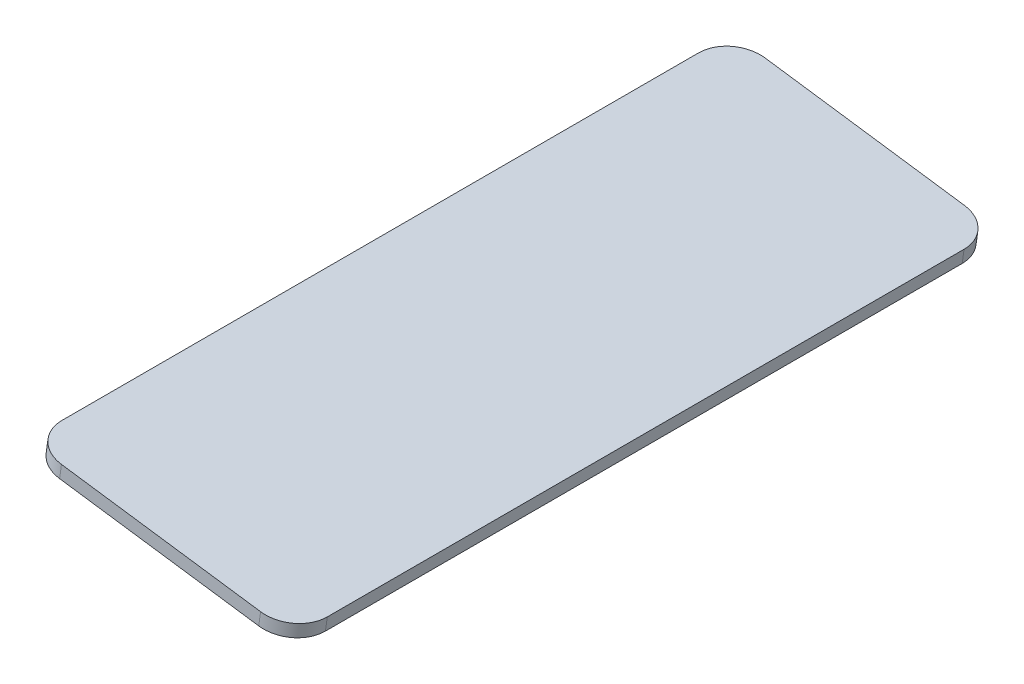
ISO-10303-21;
HEADER;
FILE_DESCRIPTION(('STEP AP214'),'2;1');
FILE_NAME('part.step','',(''),(''),'','','');
FILE_SCHEMA(('AUTOMOTIVE_DESIGN { 1 0 10303 214 1 1 1 1 }'));
ENDSEC;
DATA;
#1=APPLICATION_CONTEXT('core data for automotive mechanical design processes');
#2=APPLICATION_PROTOCOL_DEFINITION('international standard','automotive_design',2000,#1);
#3=PRODUCT_CONTEXT('',#1,'mechanical');
#4=PRODUCT('Part','Part','',(#3));
#5=PRODUCT_RELATED_PRODUCT_CATEGORY('part','',(#4));
#6=PRODUCT_DEFINITION_FORMATION('','',#4);
#7=PRODUCT_DEFINITION_CONTEXT('part definition',#1,'design');
#8=PRODUCT_DEFINITION('design','',#6,#7);
#9=PRODUCT_DEFINITION_SHAPE('','',#8);
#10=(LENGTH_UNIT() NAMED_UNIT(*) SI_UNIT(.MILLI.,.METRE.));
#11=(NAMED_UNIT(*) PLANE_ANGLE_UNIT() SI_UNIT($,.RADIAN.));
#12=(NAMED_UNIT(*) SI_UNIT($,.STERADIAN.) SOLID_ANGLE_UNIT());
#13=UNCERTAINTY_MEASURE_WITH_UNIT(LENGTH_MEASURE(1.E-05),#10,'distance_accuracy_value','');
#14=(GEOMETRIC_REPRESENTATION_CONTEXT(3) GLOBAL_UNCERTAINTY_ASSIGNED_CONTEXT((#13)) GLOBAL_UNIT_ASSIGNED_CONTEXT((#10,
#11,#12)) REPRESENTATION_CONTEXT('',''));
#15=CARTESIAN_POINT('',(0.,0.,0.));
#16=DIRECTION('',(0.,0.,1.));
#17=DIRECTION('',(1.,0.,0.));
#18=AXIS2_PLACEMENT_3D('',#15,#16,#17);
#19=CARTESIAN_POINT('',(241.030415462695,743.692615061552,-1647.));
#20=CARTESIAN_POINT('',(241.493364411612,743.627551829847,-1646.99621379538));
#21=CARTESIAN_POINT('',(242.419262309444,743.497425366437,-1646.98864138611));
#22=CARTESIAN_POINT('',(243.807021687024,743.302388505145,-1646.92742237047));
#23=CARTESIAN_POINT('',(245.423473379441,743.075211035037,-1646.81343082794));
#24=CARTESIAN_POINT('',(247.26549465002,742.81633182813,-1646.61677087434));
#25=CARTESIAN_POINT('',(249.32665900537,742.52665406917,-1646.30811990588));
#26=CARTESIAN_POINT('',(251.373183667329,742.239033784939,-1645.91205464819));
#27=CARTESIAN_POINT('',(254.076992559647,741.859038226337,-1645.2687127721));
#28=CARTESIAN_POINT('',(257.403060557336,741.391589853664,-1644.24987739416));
#29=CARTESIAN_POINT('',(261.277737551625,740.847039514685,-1642.69306378961));
#30=CARTESIAN_POINT('',(265.009273663722,740.322606314769,-1640.81284696584));
#31=CARTESIAN_POINT('',(268.571071013926,739.82202834213,-1638.62257491967));
#32=CARTESIAN_POINT('',(271.937973567542,739.348841046883,-1636.13773704623));
#33=CARTESIAN_POINT('',(275.086140082098,738.906395097145,-1633.37592163584));
#34=CARTESIAN_POINT('',(277.993294633038,738.497821169947,-1630.35667302064));
#35=CARTESIAN_POINT('',(280.638862139272,738.126010904359,-1627.10135966722));
#36=CARTESIAN_POINT('',(283.004120658046,737.793595497844,-1623.63301570002));
#37=CARTESIAN_POINT('',(285.072329262688,737.502927734209,-1619.97620048731));
#38=CARTESIAN_POINT('',(286.828858304187,737.256063676537,-1616.15674169103));
#39=CARTESIAN_POINT('',(288.261250419693,737.054754093003,-1612.20186245812));
#40=CARTESIAN_POINT('',(289.176471411075,736.926128170937,-1608.81585391766));
#41=CARTESIAN_POINT('',(289.737507729592,736.847279658434,-1606.06850419926));
#42=CARTESIAN_POINT('',(290.07204710889,736.800263214827,-1603.99156823446));
#43=CARTESIAN_POINT('',(290.320222860817,736.765384387498,-1601.90231762147));
#44=CARTESIAN_POINT('',(290.461942118239,736.745467044767,-1600.03740891089));
#45=CARTESIAN_POINT('',(290.532550732985,736.735543651113,-1598.40250024472));
#46=CARTESIAN_POINT('',(290.540062844178,736.734487892736,-1597.46750008159));
#47=CARTESIAN_POINT('',(290.543818899775,736.733960013547,-1597.));
#48=B_SPLINE_CURVE_WITH_KNOTS('',3,(#19,#20,#21,#22,#23,#24,#25,#26,#27,#28,#29,#30,#31,#32,#33,
#34,#35,#36,#37,#38,#39,#40,#41,#42,#43,#44,#45,#46,#47),.UNSPECIFIED.,.F.,.F.,(4,1,1,1,1,1,1,1,
1,1,1,1,1,1,1,1,1,1,1,1,1,1,1,1,1,1,4),(0.,0.0178605614737639,0.0357211229475166,
0.0535816844212812,0.0803714411518224,0.107161168136601,0.13395091203215,0.160740656876938,
0.21430828955088,0.267875922224825,0.321443554898773,0.375011187572713,0.428578820246657,
0.482146452920603,0.535714085594545,0.589281718268495,0.642849350942433,0.696416983616375,
0.74998461629032,0.803552248964268,0.857119881638214,0.883909624248138,0.910699369933994,
0.937489166710273,0.964278877052679,0.982139438526334,1.),.UNSPECIFIED.);
#49=DIRECTION('',(0.139173100960106,0.990268068741565,0.));
#50=VECTOR('',#49,1.);
#51=SURFACE_OF_LINEAR_EXTRUSION('',#48,#50);
#52=CARTESIAN_POINT('',(243.813877481897,763.497976436383,-1647.));
#53=CARTESIAN_POINT('',(244.276826430814,763.432913204678,-1646.99621379538));
#54=CARTESIAN_POINT('',(245.202724328646,763.302786741268,-1646.98864138611));
#55=CARTESIAN_POINT('',(246.590483706225,763.107749879976,-1646.92742237047));
#56=CARTESIAN_POINT('',(248.206935398643,762.880572409868,-1646.81343082794));
#57=CARTESIAN_POINT('',(250.048956669222,762.621693202961,-1646.61677087434));
#58=CARTESIAN_POINT('',(252.110121024572,762.332015444001,-1646.30811990588));
#59=CARTESIAN_POINT('',(254.156645686531,762.044395159771,-1645.91205464819));
#60=CARTESIAN_POINT('',(256.86045457885,761.664399601168,-1645.2687127721));
#61=CARTESIAN_POINT('',(260.186522576538,761.196951228496,-1644.24987739416));
#62=CARTESIAN_POINT('',(264.061199570827,760.652400889516,-1642.69306378961));
#63=CARTESIAN_POINT('',(267.792735682923,760.1279676896,-1640.81284696584));
#64=CARTESIAN_POINT('',(271.354533033128,759.627389716961,-1638.62257491967));
#65=CARTESIAN_POINT('',(274.721435586745,759.154202421714,-1636.13773704623));
#66=CARTESIAN_POINT('',(277.869602101301,758.711756471976,-1633.37592163584));
#67=CARTESIAN_POINT('',(280.77675665224,758.303182544778,-1630.35667302064));
#68=CARTESIAN_POINT('',(283.422324158475,757.93137227919,-1627.10135966722));
#69=CARTESIAN_POINT('',(285.787582677248,757.598956872675,-1623.63301570002));
#70=CARTESIAN_POINT('',(287.855791281891,757.30828910904,-1619.97620048731));
#71=CARTESIAN_POINT('',(289.612320323389,757.061425051368,-1616.15674169103));
#72=CARTESIAN_POINT('',(291.044712438895,756.860115467834,-1612.20186245812));
#73=CARTESIAN_POINT('',(291.959933430277,756.731489545768,-1608.81585391766));
#74=CARTESIAN_POINT('',(292.520969748795,756.652641033265,-1606.06850419926));
#75=CARTESIAN_POINT('',(292.855509128092,756.605624589658,-1603.99156823446));
#76=CARTESIAN_POINT('',(293.103684880019,756.570745762329,-1601.90231762147));
#77=CARTESIAN_POINT('',(293.245404137441,756.550828419598,-1600.03740891089));
#78=CARTESIAN_POINT('',(293.316012752187,756.540905025944,-1598.40250024472));
#79=CARTESIAN_POINT('',(293.323524863381,756.539849267567,-1597.46750008159));
#80=CARTESIAN_POINT('',(293.327280918978,756.539321388378,-1597.));
#81=B_SPLINE_CURVE_WITH_KNOTS('',3,(#52,#53,#54,#55,#56,#57,#58,#59,#60,#61,#62,#63,#64,#65,#66,
#67,#68,#69,#70,#71,#72,#73,#74,#75,#76,#77,#78,#79,#80),.UNSPECIFIED.,.F.,.F.,(4,1,1,1,1,1,1,1,
1,1,1,1,1,1,1,1,1,1,1,1,1,1,1,1,1,1,4),(0.,0.0178605614737639,0.0357211229475166,
0.0535816844212812,0.0803714411518224,0.107161168136601,0.13395091203215,0.160740656876938,
0.21430828955088,0.267875922224825,0.321443554898773,0.375011187572713,0.428578820246657,
0.482146452920603,0.535714085594545,0.589281718268495,0.642849350942433,0.696416983616375,
0.74998461629032,0.803552248964268,0.857119881638214,0.883909624248138,0.910699369933994,
0.937489166710273,0.964278877052679,0.982139438526334,1.),.UNSPECIFIED.);
#82=CARTESIAN_POINT('',(243.813877481897,763.497976436383,-1647.));
#83=VERTEX_POINT('',#82);
#84=CARTESIAN_POINT('',(293.327280918997,756.539321388375,-1597.));
#85=VERTEX_POINT('',#84);
#86=EDGE_CURVE('E213',#83,#85,#81,.T.);
#87=ORIENTED_EDGE('',*,*,#86,.T.);
#88=DIRECTION('',(0.139173100960106,0.990268068741565,0.));
#89=VECTOR('',#88,1.);
#90=CARTESIAN_POINT('',(290.543818899795,736.733960013544,-1597.));
#91=LINE('',#90,#89);
#92=CARTESIAN_POINT('',(290.543818899795,736.733960013544,-1597.));
#93=VERTEX_POINT('',#92);
#94=EDGE_CURVE('E11',#93,#85,#91,.T.);
#95=ORIENTED_EDGE('',*,*,#94,.F.);
#96=CARTESIAN_POINT('',(241.030415462695,743.692615061552,-1647.));
#97=VERTEX_POINT('',#96);
#98=EDGE_CURVE('E267',#97,#93,#48,.T.);
#99=ORIENTED_EDGE('',*,*,#98,.F.);
#100=DIRECTION('',(0.139173100960106,0.990268068741565,0.));
#101=VECTOR('',#100,1.);
#102=CARTESIAN_POINT('',(241.030415462695,743.692615061552,-1647.));
#103=LINE('',#102,#101);
#104=EDGE_CURVE('E139',#97,#83,#103,.T.);
#105=ORIENTED_EDGE('',*,*,#104,.T.);
#106=EDGE_LOOP('',(#87,#95,#99,#105));
#107=FACE_BOUND('',#106,.T.);
#108=ADVANCED_FACE('F18',(#107),#51,.F.);
#109=CARTESIAN_POINT('',(290.543818899795,736.733960013544,-1597.));
#110=DIRECTION('',(-0.990268068741565,0.139173100960106,0.));
#111=DIRECTION('',(0.,0.,-1.));
#112=AXIS2_PLACEMENT_3D('',#109,#110,#111);
#113=PLANE('',#112);
#114=CARTESIAN_POINT('',(293.327280918997,756.539321388375,-1597.));
#115=CARTESIAN_POINT('',(293.327280918997,756.539321388375,-647.));
#116=B_SPLINE_CURVE_WITH_KNOTS('',1,(#114,#115),.UNSPECIFIED.,.F.,.F.,(2,2),(200.,1150.),.UNSPECIFIED.);
#117=CARTESIAN_POINT('',(293.327280918997,756.539321388375,-647.));
#118=VERTEX_POINT('',#117);
#119=EDGE_CURVE('E203',#85,#118,#116,.T.);
#120=ORIENTED_EDGE('',*,*,#119,.T.);
#121=DIRECTION('',(0.139173100960106,0.990268068741565,0.));
#122=VECTOR('',#121,1.);
#123=CARTESIAN_POINT('',(290.543818899795,736.733960013544,-647.));
#124=LINE('',#123,#122);
#125=CARTESIAN_POINT('',(290.543818899795,736.733960013544,-647.));
#126=VERTEX_POINT('',#125);
#127=EDGE_CURVE('E28',#126,#118,#124,.T.);
#128=ORIENTED_EDGE('',*,*,#127,.F.);
#129=CARTESIAN_POINT('',(290.543818899795,736.733960013544,-1597.));
#130=CARTESIAN_POINT('',(290.543818899795,736.733960013544,-647.));
#131=B_SPLINE_CURVE_WITH_KNOTS('',1,(#129,#130),.UNSPECIFIED.,.F.,.F.,(2,2),(200.,1150.),.UNSPECIFIED.);
#132=EDGE_CURVE('E96',#93,#126,#131,.T.);
#133=ORIENTED_EDGE('',*,*,#132,.F.);
#134=ORIENTED_EDGE('',*,*,#94,.T.);
#135=EDGE_LOOP('',(#120,#128,#133,#134));
#136=FACE_BOUND('',#135,.T.);
#137=ADVANCED_FACE('F195',(#136),#113,.F.);
#138=CARTESIAN_POINT('',(290.543818899774,736.733960013547,-647.));
#139=CARTESIAN_POINT('',(290.540069542228,736.734486951386,-646.532501386716));
#140=CARTESIAN_POINT('',(290.532570827136,736.735540827064,-645.597504160148));
#141=CARTESIAN_POINT('',(290.471947590743,736.744060867309,-644.196106476647));
#142=CARTESIAN_POINT('',(290.359065406069,736.759925423766,-642.563768987999));
#143=CARTESIAN_POINT('',(290.164319333612,736.787295199345,-640.703645119803));
#144=CARTESIAN_POINT('',(289.85867213517,736.830251111738,-638.622224522278));
#145=CARTESIAN_POINT('',(289.466461357338,736.885372741833,-636.555587490793));
#146=CARTESIAN_POINT('',(288.829380440157,736.974908625708,-633.825206720509));
#147=CARTESIAN_POINT('',(287.820460298082,737.116703104623,-630.466451548371));
#148=CARTESIAN_POINT('',(286.278797496509,737.333369681585,-626.553695884935));
#149=CARTESIAN_POINT('',(284.416878813625,737.595045287426,-622.785487831091));
#150=CARTESIAN_POINT('',(282.247922344454,737.899872240036,-619.188686659131));
#151=CARTESIAN_POINT('',(279.787266742375,738.245694832268,-615.788695626506));
#152=CARTESIAN_POINT('',(277.05232912971,738.630065247211,-612.609590277227));
#153=CARTESIAN_POINT('',(274.062463634485,739.050263439558,-609.673865454116));
#154=CARTESIAN_POINT('',(270.838830766844,739.50331549355,-607.002298441361));
#155=CARTESIAN_POINT('',(267.404240484719,739.986015678661,-604.613795172969));
#156=CARTESIAN_POINT('',(263.783013146277,740.494945991453,-602.525261098281));
#157=CARTESIAN_POINT('',(260.000725060449,741.02651191612,-600.751469640246));
#158=CARTESIAN_POINT('',(256.08433444037,741.576924722887,-599.305000587349));
#159=CARTESIAN_POINT('',(252.731278302267,742.04816603134,-598.380785195305));
#160=CARTESIAN_POINT('',(250.010665602472,742.430523211072,-597.814235251681));
#161=CARTESIAN_POINT('',(247.953942235709,742.719576829788,-597.476408162373));
#162=CARTESIAN_POINT('',(245.885024066063,743.010344316281,-597.225793445246));
#163=CARTESIAN_POINT('',(244.038264518857,743.269889444541,-597.082681431544));
#164=CARTESIAN_POINT('',(242.419266671414,743.497424753401,-597.011378905516));
#165=CARTESIAN_POINT('',(241.493365865571,743.627551625506,-597.003792968505));
#166=CARTESIAN_POINT('',(241.03041546265,743.692615061559,-597.));
#167=B_SPLINE_CURVE_WITH_KNOTS('',3,(#138,#139,#140,#141,#142,#143,#144,#145,#146,#147,#148,
#149,#150,#151,#152,#153,#154,#155,#156,#157,#158,#159,#160,#161,#162,#163,#164,#165,#166),
.UNSPECIFIED.,.F.,.F.,(4,1,1,1,1,1,1,1,1,1,1,1,1,1,1,1,1,1,1,1,1,1,1,1,1,1,4),(0.,
0.0178605614737474,0.0357211229474946,0.0535816844212405,0.0803714411517632,0.107161168136524,
0.133950912032047,0.160740656876812,0.214308289550719,0.26787592222462,0.321443554898522,
0.375011187572426,0.428578820246331,0.48214645292023,0.535714085594131,0.589281718268036,
0.642849350941943,0.696416983615839,0.749984616289743,0.803552248963646,0.85711988163755,
0.883909624247454,0.910699369933287,0.937489166709552,0.964278877051934,0.982139438525963,1.),.UNSPECIFIED.);
#168=DIRECTION('',(0.139173100960106,0.990268068741565,0.));
#169=VECTOR('',#168,1.);
#170=SURFACE_OF_LINEAR_EXTRUSION('',#167,#169);
#171=CARTESIAN_POINT('',(293.327280918976,756.539321388378,-647.));
#172=CARTESIAN_POINT('',(293.32353156143,756.539848326217,-646.532501386716));
#173=CARTESIAN_POINT('',(293.316032846338,756.540902201896,-645.597504160148));
#174=CARTESIAN_POINT('',(293.255409609944,756.549422242141,-644.196106476647));
#175=CARTESIAN_POINT('',(293.142527425271,756.565286798598,-642.563768987999));
#176=CARTESIAN_POINT('',(292.947781352815,756.592656574176,-640.703645119803));
#177=CARTESIAN_POINT('',(292.642134154372,756.635612486569,-638.622224522278));
#178=CARTESIAN_POINT('',(292.24992337654,756.690734116665,-636.555587490793));
#179=CARTESIAN_POINT('',(291.612842459358,756.780270000539,-633.825206720509));
#180=CARTESIAN_POINT('',(290.603922317284,756.922064479454,-630.466451548371));
#181=CARTESIAN_POINT('',(289.062259515711,757.138731056417,-626.553695884935));
#182=CARTESIAN_POINT('',(287.200340832827,757.400406662258,-622.785487831091));
#183=CARTESIAN_POINT('',(285.031384363655,757.705233614868,-619.188686659131));
#184=CARTESIAN_POINT('',(282.570728761577,758.0510562071,-615.788695626506));
#185=CARTESIAN_POINT('',(279.835791148912,758.435426622042,-612.609590277227));
#186=CARTESIAN_POINT('',(276.845925653688,758.855624814389,-609.673865454116));
#187=CARTESIAN_POINT('',(273.622292786047,759.308676868382,-607.002298441361));
#188=CARTESIAN_POINT('',(270.18770250392,759.791377053493,-604.613795172969));
#189=CARTESIAN_POINT('',(266.566475165479,760.300307366284,-602.525261098281));
#190=CARTESIAN_POINT('',(262.784187079652,760.831873290952,-600.751469640246));
#191=CARTESIAN_POINT('',(258.867796459572,761.382286097718,-599.305000587349));
#192=CARTESIAN_POINT('',(255.514740321469,761.853527406172,-598.380785195305));
#193=CARTESIAN_POINT('',(252.794127621674,762.235884585903,-597.814235251681));
#194=CARTESIAN_POINT('',(250.737404254911,762.52493820462,-597.476408162373));
#195=CARTESIAN_POINT('',(248.668486085265,762.815705691113,-597.225793445246));
#196=CARTESIAN_POINT('',(246.821726538058,763.075250819372,-597.082681431544));
#197=CARTESIAN_POINT('',(245.202728690616,763.302786128232,-597.011378905516));
#198=CARTESIAN_POINT('',(244.276827884774,763.432913000337,-597.003792968505));
#199=CARTESIAN_POINT('',(243.813877481853,763.49797643639,-597.));
#200=B_SPLINE_CURVE_WITH_KNOTS('',3,(#171,#172,#173,#174,#175,#176,#177,#178,#179,#180,#181,
#182,#183,#184,#185,#186,#187,#188,#189,#190,#191,#192,#193,#194,#195,#196,#197,#198,#199),
.UNSPECIFIED.,.F.,.F.,(4,1,1,1,1,1,1,1,1,1,1,1,1,1,1,1,1,1,1,1,1,1,1,1,1,1,4),(0.,
0.0178605614737474,0.0357211229474946,0.0535816844212405,0.0803714411517632,0.107161168136524,
0.133950912032047,0.160740656876812,0.214308289550719,0.26787592222462,0.321443554898522,
0.375011187572426,0.428578820246331,0.48214645292023,0.535714085594131,0.589281718268036,
0.642849350941943,0.696416983615839,0.749984616289743,0.803552248963646,0.85711988163755,
0.883909624247454,0.910699369933287,0.937489166709552,0.964278877051934,0.982139438525963,1.),.UNSPECIFIED.);
#201=CARTESIAN_POINT('',(243.813877481853,763.49797643639,-597.));
#202=VERTEX_POINT('',#201);
#203=EDGE_CURVE('E212',#118,#202,#200,.T.);
#204=ORIENTED_EDGE('',*,*,#203,.T.);
#205=DIRECTION('',(0.139173100960106,0.990268068741565,0.));
#206=VECTOR('',#205,1.);
#207=CARTESIAN_POINT('',(241.03041546265,743.692615061559,-597.));
#208=LINE('',#207,#206);
#209=CARTESIAN_POINT('',(241.03041546265,743.692615061559,-597.));
#210=VERTEX_POINT('',#209);
#211=EDGE_CURVE('E218',#210,#202,#208,.T.);
#212=ORIENTED_EDGE('',*,*,#211,.F.);
#213=EDGE_CURVE('E179',#126,#210,#167,.T.);
#214=ORIENTED_EDGE('',*,*,#213,.F.);
#215=ORIENTED_EDGE('',*,*,#127,.T.);
#216=EDGE_LOOP('',(#204,#212,#214,#215));
#217=FACE_BOUND('',#216,.T.);
#218=ADVANCED_FACE('F193',(#217),#170,.F.);
#219=CARTESIAN_POINT('',(241.030415462651,743.692615061558,-597.));
#220=DIRECTION('',(0.,0.,-1.));
#221=DIRECTION('',(0.990268068741565,-0.139173100960106,0.));
#222=AXIS2_PLACEMENT_3D('',#219,#220,#221);
#223=PLANE('',#222);
#224=CARTESIAN_POINT('',(243.813877481853,763.49797643639,-597.));
#225=CARTESIAN_POINT('',(-53.2665431405482,805.249906724412,-597.));
#226=B_SPLINE_CURVE_WITH_KNOTS('',1,(#224,#225),.UNSPECIFIED.,.F.,.F.,(2,2),(610.156529220753,
910.156529220753),.UNSPECIFIED.);
#227=CARTESIAN_POINT('',(-53.2665431405482,805.249906724412,-597.));
#228=VERTEX_POINT('',#227);
#229=EDGE_CURVE('E222',#202,#228,#226,.T.);
#230=ORIENTED_EDGE('',*,*,#229,.T.);
#231=DIRECTION('',(0.139173100960106,0.990268068741565,0.));
#232=VECTOR('',#231,1.);
#233=CARTESIAN_POINT('',(-56.0500051597503,785.444545349581,-597.));
#234=LINE('',#233,#232);
#235=CARTESIAN_POINT('',(-56.0500051597503,785.444545349581,-597.));
#236=VERTEX_POINT('',#235);
#237=EDGE_CURVE('E283',#236,#228,#234,.T.);
#238=ORIENTED_EDGE('',*,*,#237,.F.);
#239=CARTESIAN_POINT('',(241.030415462651,743.692615061558,-597.));
#240=CARTESIAN_POINT('',(-56.0500051597503,785.444545349581,-597.));
#241=B_SPLINE_CURVE_WITH_KNOTS('',1,(#239,#240),.UNSPECIFIED.,.F.,.F.,(2,2),(610.156529220753,
910.156529220753),.UNSPECIFIED.);
#242=EDGE_CURVE('E171',#210,#236,#241,.T.);
#243=ORIENTED_EDGE('',*,*,#242,.F.);
#244=ORIENTED_EDGE('',*,*,#211,.T.);
#245=EDGE_LOOP('',(#230,#238,#243,#244));
#246=FACE_BOUND('',#245,.T.);
#247=ADVANCED_FACE('F163',(#246),#223,.F.);
#248=CARTESIAN_POINT('',(-56.0500051597503,785.444545349581,-597.));
#249=CARTESIAN_POINT('',(-56.5129541086664,785.509608581286,-597.003786204628));
#250=CARTESIAN_POINT('',(-57.4388520064986,785.639735044696,-597.011358613886));
#251=CARTESIAN_POINT('',(-58.8266113840781,785.834771905988,-597.072577629531));
#252=CARTESIAN_POINT('',(-60.4430630764959,786.061949376096,-597.186569172061));
#253=CARTESIAN_POINT('',(-62.2850843470751,786.320828583003,-597.383229125667));
#254=CARTESIAN_POINT('',(-64.3462487024249,786.610506341963,-597.691880094117));
#255=CARTESIAN_POINT('',(-66.3927733643836,786.898126626194,-598.087945351811));
#256=CARTESIAN_POINT('',(-69.0965822567022,787.278122184796,-598.731287227906));
#257=CARTESIAN_POINT('',(-72.4226502543909,787.745570557468,-599.750122605842));
#258=CARTESIAN_POINT('',(-76.2973272486796,788.290120896448,-601.306936210397));
#259=CARTESIAN_POINT('',(-80.0288633607762,788.814554096365,-603.187153034161));
#260=CARTESIAN_POINT('',(-83.5906607109807,789.315132069003,-605.377425080323));
#261=CARTESIAN_POINT('',(-86.9575632645971,789.78831936425,-607.862262953774));
#262=CARTESIAN_POINT('',(-90.1057297791532,790.230765313988,-610.624078364162));
#263=CARTESIAN_POINT('',(-93.0128843300925,790.639339241186,-613.643326979362));
#264=CARTESIAN_POINT('',(-95.6584518363275,791.011149506774,-616.898640332783));
#265=CARTESIAN_POINT('',(-98.023710355101,791.343564913289,-620.366984299979));
#266=CARTESIAN_POINT('',(-100.091918959743,791.634232676924,-624.023799512695));
#267=CARTESIAN_POINT('',(-101.848448001241,791.881096734595,-627.843258308973));
#268=CARTESIAN_POINT('',(-103.280840116748,792.08240631813,-631.798137541882));
#269=CARTESIAN_POINT('',(-104.196061108129,792.211032240196,-635.184146082342));
#270=CARTESIAN_POINT('',(-104.757097426647,792.289880752699,-637.93149580074));
#271=CARTESIAN_POINT('',(-105.091636805944,792.336897196306,-640.008431765541));
#272=CARTESIAN_POINT('',(-105.339812557873,792.371776023635,-642.097682378533));
#273=CARTESIAN_POINT('',(-105.48153181529,792.391693366366,-643.962591089107));
#274=CARTESIAN_POINT('',(-105.552140430048,792.401616760021,-645.597499755288));
#275=CARTESIAN_POINT('',(-105.559652541216,792.402672518395,-646.532499918429));
#276=CARTESIAN_POINT('',(-105.5634085968,792.403200397582,-647.));
#277=B_SPLINE_CURVE_WITH_KNOTS('',3,(#248,#249,#250,#251,#252,#253,#254,#255,#256,#257,#258,
#259,#260,#261,#262,#263,#264,#265,#266,#267,#268,#269,#270,#271,#272,#273,#274,#275,#276),
.UNSPECIFIED.,.F.,.F.,(4,1,1,1,1,1,1,1,1,1,1,1,1,1,1,1,1,1,1,1,1,1,1,1,1,1,4),(0.,
0.0178605614737562,0.035721122947513,0.0535816844212735,0.0803714411518103,0.107161168136586,
0.133950912032124,0.160740656876907,0.214308289550841,0.267875922224776,0.321443554898712,
0.375011187572644,0.428578820246581,0.482146452920515,0.535714085594449,0.589281718268381,
0.642849350942316,0.696416983616253,0.749984616290184,0.80355224896412,0.857119881638052,
0.883909624247975,0.910699369933822,0.937489166710103,0.964278877052501,0.98213943852625,1.),.UNSPECIFIED.);
#278=DIRECTION('',(0.139173100960106,0.990268068741565,0.));
#279=VECTOR('',#278,1.);
#280=SURFACE_OF_LINEAR_EXTRUSION('',#277,#279);
#281=CARTESIAN_POINT('',(-53.2665431405481,805.249906724412,-597.));
#282=CARTESIAN_POINT('',(-53.7294920894643,805.314969956117,-597.003786204628));
#283=CARTESIAN_POINT('',(-54.6553899872965,805.445096419528,-597.011358613886));
#284=CARTESIAN_POINT('',(-56.043149364876,805.640133280819,-597.072577629531));
#285=CARTESIAN_POINT('',(-57.6596010572938,805.867310750928,-597.186569172061));
#286=CARTESIAN_POINT('',(-59.501622327873,806.126189957834,-597.383229125667));
#287=CARTESIAN_POINT('',(-61.5627866832228,806.415867716794,-597.691880094117));
#288=CARTESIAN_POINT('',(-63.6093113451815,806.703488001025,-598.087945351811));
#289=CARTESIAN_POINT('',(-66.3131202375,807.083483559627,-598.731287227906));
#290=CARTESIAN_POINT('',(-69.6391882351888,807.5509319323,-599.750122605842));
#291=CARTESIAN_POINT('',(-73.5138652294775,808.095482271279,-601.306936210397));
#292=CARTESIAN_POINT('',(-77.2454013415741,808.619915471196,-603.187153034161));
#293=CARTESIAN_POINT('',(-80.8071986917786,809.120493443834,-605.377425080323));
#294=CARTESIAN_POINT('',(-84.174101245395,809.593680739081,-607.862262953774));
#295=CARTESIAN_POINT('',(-87.3222677599511,810.036126688819,-610.624078364162));
#296=CARTESIAN_POINT('',(-90.2294223108903,810.444700616017,-613.643326979362));
#297=CARTESIAN_POINT('',(-92.8749898171254,810.816510881605,-616.898640332783));
#298=CARTESIAN_POINT('',(-95.2402483358988,811.148926288121,-620.366984299979));
#299=CARTESIAN_POINT('',(-97.308456940541,811.439594051755,-624.023799512695));
#300=CARTESIAN_POINT('',(-99.064985982039,811.686458109427,-627.843258308973));
#301=CARTESIAN_POINT('',(-100.497378097546,811.887767692961,-631.798137541882));
#302=CARTESIAN_POINT('',(-101.412599088927,812.016393615027,-635.184146082342));
#303=CARTESIAN_POINT('',(-101.973635407445,812.09524212753,-637.93149580074));
#304=CARTESIAN_POINT('',(-102.308174786742,812.142258571137,-640.008431765541));
#305=CARTESIAN_POINT('',(-102.556350538671,812.177137398466,-642.097682378533));
#306=CARTESIAN_POINT('',(-102.698069796088,812.197054741197,-643.962591089107));
#307=CARTESIAN_POINT('',(-102.768678410846,812.206978134852,-645.597499755288));
#308=CARTESIAN_POINT('',(-102.776190522014,812.208033893226,-646.532499918429));
#309=CARTESIAN_POINT('',(-102.779946577598,812.208561772413,-647.));
#310=B_SPLINE_CURVE_WITH_KNOTS('',3,(#281,#282,#283,#284,#285,#286,#287,#288,#289,#290,#291,
#292,#293,#294,#295,#296,#297,#298,#299,#300,#301,#302,#303,#304,#305,#306,#307,#308,#309),
.UNSPECIFIED.,.F.,.F.,(4,1,1,1,1,1,1,1,1,1,1,1,1,1,1,1,1,1,1,1,1,1,1,1,1,1,4),(0.,
0.0178605614737562,0.035721122947513,0.0535816844212735,0.0803714411518103,0.107161168136586,
0.133950912032124,0.160740656876907,0.214308289550841,0.267875922224776,0.321443554898712,
0.375011187572644,0.428578820246581,0.482146452920515,0.535714085594449,0.589281718268381,
0.642849350942316,0.696416983616253,0.749984616290184,0.80355224896412,0.857119881638052,
0.883909624247975,0.910699369933822,0.937489166710103,0.964278877052501,0.98213943852625,1.),.UNSPECIFIED.);
#311=CARTESIAN_POINT('',(-102.779946577598,812.208561772413,-647.));
#312=VERTEX_POINT('',#311);
#313=EDGE_CURVE('E227',#228,#312,#310,.T.);
#314=ORIENTED_EDGE('',*,*,#313,.T.);
#315=DIRECTION('',(0.139173100960106,0.990268068741565,0.));
#316=VECTOR('',#315,1.);
#317=CARTESIAN_POINT('',(-105.5634085968,792.403200397582,-647.));
#318=LINE('',#317,#316);
#319=CARTESIAN_POINT('',(-105.5634085968,792.403200397582,-647.));
#320=VERTEX_POINT('',#319);
#321=EDGE_CURVE('E131',#320,#312,#318,.T.);
#322=ORIENTED_EDGE('',*,*,#321,.F.);
#323=EDGE_CURVE('E120',#236,#320,#277,.T.);
#324=ORIENTED_EDGE('',*,*,#323,.F.);
#325=ORIENTED_EDGE('',*,*,#237,.T.);
#326=EDGE_LOOP('',(#314,#322,#324,#325));
#327=FACE_BOUND('',#326,.T.);
#328=ADVANCED_FACE('F160',(#327),#280,.F.);
#329=CARTESIAN_POINT('',(-105.5634085968,792.403200397582,-647.));
#330=DIRECTION('',(0.990268068741565,-0.139173100960106,0.));
#331=DIRECTION('',(0.,0.,1.));
#332=AXIS2_PLACEMENT_3D('',#329,#330,#331);
#333=PLANE('',#332);
#334=CARTESIAN_POINT('',(-102.779946577598,812.208561772413,-647.));
#335=CARTESIAN_POINT('',(-102.779946577598,812.208561772413,-1597.));
#336=B_SPLINE_CURVE_WITH_KNOTS('',1,(#334,#335),.UNSPECIFIED.,.F.,.F.,(2,2),(200.,1150.),.UNSPECIFIED.);
#337=CARTESIAN_POINT('',(-102.779946577598,812.208561772413,-1597.));
#338=VERTEX_POINT('',#337);
#339=EDGE_CURVE('E129',#312,#338,#336,.T.);
#340=ORIENTED_EDGE('',*,*,#339,.T.);
#341=DIRECTION('',(0.139173100960106,0.990268068741565,0.));
#342=VECTOR('',#341,1.);
#343=CARTESIAN_POINT('',(-105.5634085968,792.403200397582,-1597.));
#344=LINE('',#343,#342);
#345=CARTESIAN_POINT('',(-105.5634085968,792.403200397582,-1597.));
#346=VERTEX_POINT('',#345);
#347=EDGE_CURVE('E126',#346,#338,#344,.T.);
#348=ORIENTED_EDGE('',*,*,#347,.F.);
#349=CARTESIAN_POINT('',(-105.5634085968,792.403200397582,-647.));
#350=CARTESIAN_POINT('',(-105.5634085968,792.403200397582,-1597.));
#351=B_SPLINE_CURVE_WITH_KNOTS('',1,(#349,#350),.UNSPECIFIED.,.F.,.F.,(2,2),(200.,1150.),.UNSPECIFIED.);
#352=EDGE_CURVE('E114',#320,#346,#351,.T.);
#353=ORIENTED_EDGE('',*,*,#352,.F.);
#354=ORIENTED_EDGE('',*,*,#321,.T.);
#355=EDGE_LOOP('',(#340,#348,#353,#354));
#356=FACE_BOUND('',#355,.T.);
#357=ADVANCED_FACE('F127',(#356),#333,.F.);
#358=CARTESIAN_POINT('',(-105.563408596829,792.403200397586,-1597.));
#359=CARTESIAN_POINT('',(-105.559659239283,792.402673459747,-1597.46749861328));
#360=CARTESIAN_POINT('',(-105.55216052419,792.401619584069,-1598.40249583985));
#361=CARTESIAN_POINT('',(-105.491537287798,792.393099543823,-1599.80389352335));
#362=CARTESIAN_POINT('',(-105.378655103123,792.377234987366,-1601.436231012));
#363=CARTESIAN_POINT('',(-105.183909030667,792.349865211788,-1603.2963548802));
#364=CARTESIAN_POINT('',(-104.878261832225,792.306909299395,-1605.37777547772));
#365=CARTESIAN_POINT('',(-104.486051054392,792.251787669299,-1607.44441250921));
#366=CARTESIAN_POINT('',(-103.848970137211,792.162251785425,-1610.17479327949));
#367=CARTESIAN_POINT('',(-102.840049995137,792.020457306511,-1613.53354845163));
#368=CARTESIAN_POINT('',(-101.298387193563,791.803790729547,-1617.44630411507));
#369=CARTESIAN_POINT('',(-99.4364685106801,791.542115123707,-1621.21451216891));
#370=CARTESIAN_POINT('',(-97.2675120415082,791.237288171096,-1624.81131334087));
#371=CARTESIAN_POINT('',(-94.8068564394302,790.891465578865,-1628.21130437349));
#372=CARTESIAN_POINT('',(-92.0719188267646,790.507095163922,-1631.39040972277));
#373=CARTESIAN_POINT('',(-89.0820533315408,790.086896971575,-1634.32613454588));
#374=CARTESIAN_POINT('',(-85.8584204638994,789.633844917582,-1636.99770155864));
#375=CARTESIAN_POINT('',(-82.4238301817732,789.151144732472,-1639.38620482703));
#376=CARTESIAN_POINT('',(-78.8026028433318,788.642214419679,-1641.47473890172));
#377=CARTESIAN_POINT('',(-75.0203147575045,788.110648495013,-1643.24853035975));
#378=CARTESIAN_POINT('',(-71.1039241374247,787.560235688246,-1644.69499941265));
#379=CARTESIAN_POINT('',(-67.7508679993219,787.088994379792,-1645.6192148047));
#380=CARTESIAN_POINT('',(-65.0302552995267,786.706637200062,-1646.18576474832));
#381=CARTESIAN_POINT('',(-62.9735319327636,786.417583581345,-1646.52359183763));
#382=CARTESIAN_POINT('',(-60.9046137631181,786.126816094851,-1646.77420655475));
#383=CARTESIAN_POINT('',(-59.0578542159114,785.867270966593,-1646.91731856846));
#384=CARTESIAN_POINT('',(-57.4388563684683,785.639735657731,-1646.98862109449));
#385=CARTESIAN_POINT('',(-56.5129555626264,785.509608785627,-1646.9962070315));
#386=CARTESIAN_POINT('',(-56.0500051597055,785.444545349574,-1647.));
#387=B_SPLINE_CURVE_WITH_KNOTS('',3,(#358,#359,#360,#361,#362,#363,#364,#365,#366,#367,#368,
#369,#370,#371,#372,#373,#374,#375,#376,#377,#378,#379,#380,#381,#382,#383,#384,#385,#386),
.UNSPECIFIED.,.F.,.F.,(4,1,1,1,1,1,1,1,1,1,1,1,1,1,1,1,1,1,1,1,1,1,1,1,1,1,4),(0.,
0.0178605614737516,0.0357211229474984,0.0535816844212503,0.0803714411517652,0.10716116813653,
0.133950912032052,0.16074065687682,0.214308289550719,0.267875922224619,0.321443554898524,
0.375011187572429,0.428578820246331,0.482146452920231,0.535714085594133,0.589281718268036,
0.642849350941935,0.696416983615843,0.74998461628974,0.803552248963645,0.857119881637547,
0.883909624247451,0.910699369933284,0.937489166709549,0.96427887705193,0.982139438525965,1.),.UNSPECIFIED.);
#388=DIRECTION('',(0.139173100960106,0.990268068741565,0.));
#389=VECTOR('',#388,1.);
#390=SURFACE_OF_LINEAR_EXTRUSION('',#387,#389);
#391=CARTESIAN_POINT('',(-102.779946577627,812.208561772417,-1597.));
#392=CARTESIAN_POINT('',(-102.77619722008,812.208034834578,-1597.46749861328));
#393=CARTESIAN_POINT('',(-102.768698504988,812.2069809589,-1598.40249583985));
#394=CARTESIAN_POINT('',(-102.708075268596,812.198460918655,-1599.80389352335));
#395=CARTESIAN_POINT('',(-102.595193083921,812.182596362198,-1601.436231012));
#396=CARTESIAN_POINT('',(-102.400447011465,812.155226586619,-1603.2963548802));
#397=CARTESIAN_POINT('',(-102.094799813023,812.112270674226,-1605.37777547772));
#398=CARTESIAN_POINT('',(-101.70258903519,812.05714904413,-1607.44441250921));
#399=CARTESIAN_POINT('',(-101.065508118009,811.967613160256,-1610.17479327949));
#400=CARTESIAN_POINT('',(-100.056587975935,811.825818681342,-1613.53354845163));
#401=CARTESIAN_POINT('',(-98.5149251743607,811.609152104378,-1617.44630411507));
#402=CARTESIAN_POINT('',(-96.653006491478,811.347476498538,-1621.21451216891));
#403=CARTESIAN_POINT('',(-94.4840500223061,811.042649545927,-1624.81131334087));
#404=CARTESIAN_POINT('',(-92.023394420228,810.696826953696,-1628.21130437349));
#405=CARTESIAN_POINT('',(-89.2884568075625,810.312456538753,-1631.39040972277));
#406=CARTESIAN_POINT('',(-86.2985913123387,809.892258346406,-1634.32613454588));
#407=CARTESIAN_POINT('',(-83.0749584446972,809.439206292414,-1636.99770155864));
#408=CARTESIAN_POINT('',(-79.6403681625711,808.956506107303,-1639.38620482703));
#409=CARTESIAN_POINT('',(-76.0191408241297,808.447575794511,-1641.47473890172));
#410=CARTESIAN_POINT('',(-72.2368527383024,807.916009869844,-1643.24853035975));
#411=CARTESIAN_POINT('',(-68.3204621182226,807.365597063077,-1644.69499941265));
#412=CARTESIAN_POINT('',(-64.9674059801198,806.894355754624,-1645.6192148047));
#413=CARTESIAN_POINT('',(-62.2467932803246,806.511998574893,-1646.18576474832));
#414=CARTESIAN_POINT('',(-60.1900699135615,806.222944956176,-1646.52359183763));
#415=CARTESIAN_POINT('',(-58.121151743916,805.932177469683,-1646.77420655475));
#416=CARTESIAN_POINT('',(-56.2743921967092,805.672632341424,-1646.91731856846));
#417=CARTESIAN_POINT('',(-54.6553943492662,805.445097032563,-1646.98862109449));
#418=CARTESIAN_POINT('',(-53.7294935434243,805.314970160458,-1646.9962070315));
#419=CARTESIAN_POINT('',(-53.2665431405034,805.249906724406,-1647.));
#420=B_SPLINE_CURVE_WITH_KNOTS('',3,(#391,#392,#393,#394,#395,#396,#397,#398,#399,#400,#401,
#402,#403,#404,#405,#406,#407,#408,#409,#410,#411,#412,#413,#414,#415,#416,#417,#418,#419),
.UNSPECIFIED.,.F.,.F.,(4,1,1,1,1,1,1,1,1,1,1,1,1,1,1,1,1,1,1,1,1,1,1,1,1,1,4),(0.,
0.0178605614737516,0.0357211229474984,0.0535816844212503,0.0803714411517652,0.10716116813653,
0.133950912032052,0.16074065687682,0.214308289550719,0.267875922224619,0.321443554898524,
0.375011187572429,0.428578820246331,0.482146452920231,0.535714085594133,0.589281718268036,
0.642849350941935,0.696416983615843,0.74998461628974,0.803552248963645,0.857119881637547,
0.883909624247451,0.910699369933284,0.937489166709549,0.96427887705193,0.982139438525965,1.),.UNSPECIFIED.);
#421=CARTESIAN_POINT('',(-53.2665431405034,805.249906724406,-1647.));
#422=VERTEX_POINT('',#421);
#423=EDGE_CURVE('E78',#338,#422,#420,.T.);
#424=ORIENTED_EDGE('',*,*,#423,.T.);
#425=DIRECTION('',(0.139173100960106,0.990268068741565,0.));
#426=VECTOR('',#425,1.);
#427=CARTESIAN_POINT('',(-56.0500051597055,785.444545349574,-1647.));
#428=LINE('',#427,#426);
#429=CARTESIAN_POINT('',(-56.0500051597055,785.444545349574,-1647.));
#430=VERTEX_POINT('',#429);
#431=EDGE_CURVE('E132',#430,#422,#428,.T.);
#432=ORIENTED_EDGE('',*,*,#431,.F.);
#433=EDGE_CURVE('E118',#346,#430,#387,.T.);
#434=ORIENTED_EDGE('',*,*,#433,.F.);
#435=ORIENTED_EDGE('',*,*,#347,.T.);
#436=EDGE_LOOP('',(#424,#432,#434,#435));
#437=FACE_BOUND('',#436,.T.);
#438=ADVANCED_FACE('F134',(#437),#390,.F.);
#439=CARTESIAN_POINT('',(-56.0500051597056,785.444545349574,-1647.));
#440=DIRECTION('',(0.,0.,1.));
#441=DIRECTION('',(-0.990268068741565,0.139173100960106,0.));
#442=AXIS2_PLACEMENT_3D('',#439,#440,#441);
#443=PLANE('',#442);
#444=CARTESIAN_POINT('',(-53.2665431405035,805.249906724406,-1647.));
#445=CARTESIAN_POINT('',(243.813877481897,763.497976436383,-1647.));
#446=B_SPLINE_CURVE_WITH_KNOTS('',1,(#444,#445),.UNSPECIFIED.,.F.,.F.,(2,2),(610.156529220798,
910.156529220798),.UNSPECIFIED.);
#447=EDGE_CURVE('E86',#422,#83,#446,.T.);
#448=ORIENTED_EDGE('',*,*,#447,.T.);
#449=ORIENTED_EDGE('',*,*,#104,.F.);
#450=CARTESIAN_POINT('',(-56.0500051597056,785.444545349574,-1647.));
#451=CARTESIAN_POINT('',(241.030415462695,743.692615061552,-1647.));
#452=B_SPLINE_CURVE_WITH_KNOTS('',1,(#450,#451),.UNSPECIFIED.,.F.,.F.,(2,2),(610.156529220798,
910.156529220798),.UNSPECIFIED.);
#453=EDGE_CURVE('E40',#430,#97,#452,.T.);
#454=ORIENTED_EDGE('',*,*,#453,.F.);
#455=ORIENTED_EDGE('',*,*,#431,.T.);
#456=EDGE_LOOP('',(#448,#449,#454,#455));
#457=FACE_BOUND('',#456,.T.);
#458=ADVANCED_FACE('F156',(#457),#443,.F.);
#459=CARTESIAN_POINT('',(276.041546864039,738.772121430531,-1632.35546492514));
#460=DIRECTION('',(0.139173100959728,0.990268068741618,1.78048762611642E-11));
#461=DIRECTION('',(-2.47784818779442E-12,-1.76316161212273E-11,1.));
#462=AXIS2_PLACEMENT_3D('',#459,#460,#461);
#463=PLANE('',#462);
#464=ORIENTED_EDGE('',*,*,#98,.T.);
#465=ORIENTED_EDGE('',*,*,#132,.T.);
#466=ORIENTED_EDGE('',*,*,#213,.T.);
#467=ORIENTED_EDGE('',*,*,#242,.T.);
#468=ORIENTED_EDGE('',*,*,#323,.T.);
#469=ORIENTED_EDGE('',*,*,#352,.T.);
#470=ORIENTED_EDGE('',*,*,#433,.T.);
#471=ORIENTED_EDGE('',*,*,#453,.T.);
#472=EDGE_LOOP('',(#464,#465,#466,#467,#468,#469,#470,#471));
#473=FACE_BOUND('',#472,.T.);
#474=ADVANCED_FACE('F116',(#473),#463,.F.);
#475=CARTESIAN_POINT('',(278.825008883241,758.577482805362,-1632.35546492514));
#476=DIRECTION('',(0.139173100959728,0.990268068741618,1.78048762611642E-11));
#477=DIRECTION('',(-2.47784818779442E-12,-1.76316161212273E-11,1.));
#478=AXIS2_PLACEMENT_3D('',#475,#476,#477);
#479=PLANE('',#478);
#480=ORIENTED_EDGE('',*,*,#86,.F.);
#481=ORIENTED_EDGE('',*,*,#447,.F.);
#482=ORIENTED_EDGE('',*,*,#423,.F.);
#483=ORIENTED_EDGE('',*,*,#339,.F.);
#484=ORIENTED_EDGE('',*,*,#313,.F.);
#485=ORIENTED_EDGE('',*,*,#229,.F.);
#486=ORIENTED_EDGE('',*,*,#203,.F.);
#487=ORIENTED_EDGE('',*,*,#119,.F.);
#488=EDGE_LOOP('',(#480,#481,#482,#483,#484,#485,#486,#487));
#489=FACE_BOUND('',#488,.T.);
#490=ADVANCED_FACE('F220',(#489),#479,.T.);
#491=CLOSED_SHELL('',(#108,#137,#218,#247,#328,#357,#438,#458,#474,#490));
#492=MANIFOLD_SOLID_BREP('B1',#491);
#493=ADVANCED_BREP_SHAPE_REPRESENTATION('',(#18,#492),#14);
#494=SHAPE_DEFINITION_REPRESENTATION(#9,#493);
ENDSEC;
END-ISO-10303-21;
